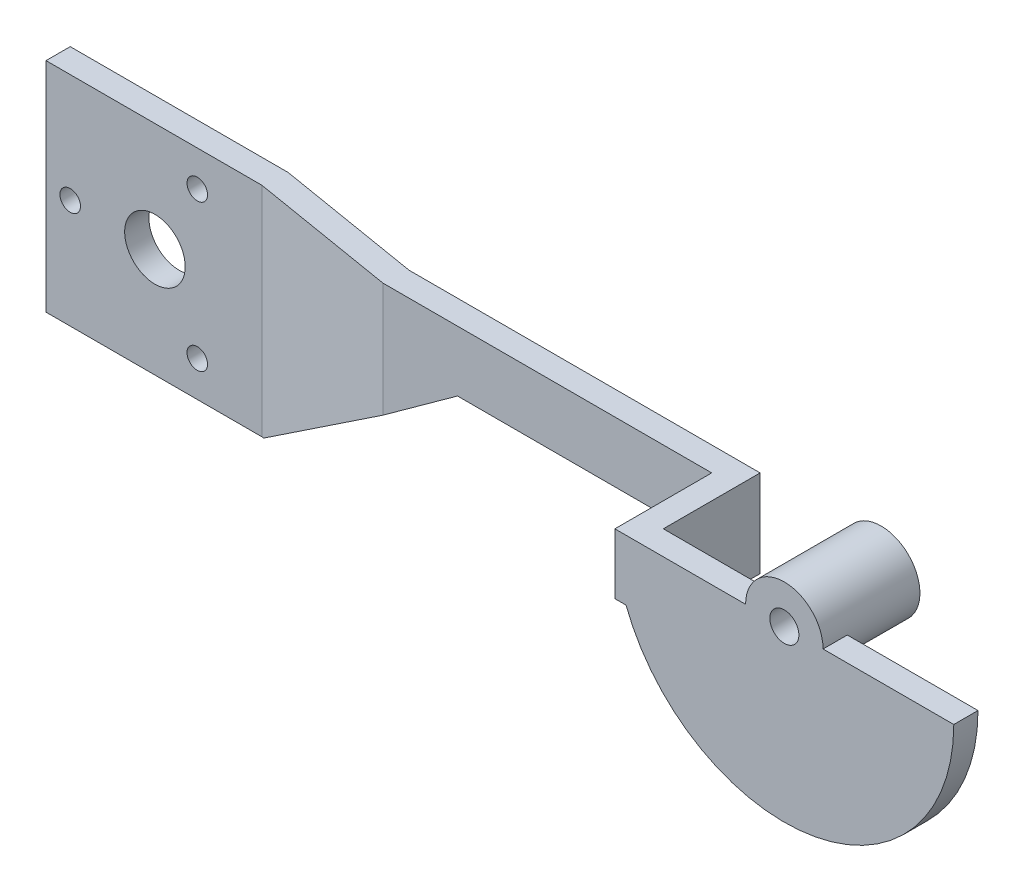
ISO-10303-21;
HEADER;
FILE_DESCRIPTION(('STEP AP214'),'2;1');
FILE_NAME('part.step','',(''),(''),'','','');
FILE_SCHEMA(('AUTOMOTIVE_DESIGN { 1 0 10303 214 1 1 1 1 }'));
ENDSEC;
DATA;
#1=APPLICATION_CONTEXT('core data for automotive mechanical design processes');
#2=APPLICATION_PROTOCOL_DEFINITION('international standard','automotive_design',2000,#1);
#3=PRODUCT_CONTEXT('',#1,'mechanical');
#4=PRODUCT('Part','Part','',(#3));
#5=PRODUCT_RELATED_PRODUCT_CATEGORY('part','',(#4));
#6=PRODUCT_DEFINITION_FORMATION('','',#4);
#7=PRODUCT_DEFINITION_CONTEXT('part definition',#1,'design');
#8=PRODUCT_DEFINITION('design','',#6,#7);
#9=PRODUCT_DEFINITION_SHAPE('','',#8);
#10=(LENGTH_UNIT() NAMED_UNIT(*) SI_UNIT(.MILLI.,.METRE.));
#11=(NAMED_UNIT(*) PLANE_ANGLE_UNIT() SI_UNIT($,.RADIAN.));
#12=(NAMED_UNIT(*) SI_UNIT($,.STERADIAN.) SOLID_ANGLE_UNIT());
#13=UNCERTAINTY_MEASURE_WITH_UNIT(LENGTH_MEASURE(1.E-05),#10,'distance_accuracy_value','');
#14=(GEOMETRIC_REPRESENTATION_CONTEXT(3) GLOBAL_UNCERTAINTY_ASSIGNED_CONTEXT((#13)) GLOBAL_UNIT_ASSIGNED_CONTEXT((#10,
#11,#12)) REPRESENTATION_CONTEXT('',''));
#15=CARTESIAN_POINT('',(0.,0.,0.));
#16=DIRECTION('',(0.,0.,1.));
#17=DIRECTION('',(1.,0.,0.));
#18=AXIS2_PLACEMENT_3D('',#15,#16,#17);
#19=CARTESIAN_POINT('',(310.,45.0000000000001,60.));
#20=DIRECTION('',(0.,0.,-1.));
#21=DIRECTION('',(-1.,0.,0.));
#22=AXIS2_PLACEMENT_3D('',#19,#20,#21);
#23=CYLINDRICAL_SURFACE('',#22,5.99999999999999);
#24=CARTESIAN_POINT('',(310.,45.0000000000001,60.));
#25=DIRECTION('',(0.,0.,1.));
#26=DIRECTION('',(1.,0.,0.));
#27=AXIS2_PLACEMENT_3D('',#24,#25,#26);
#28=CIRCLE('',#27,5.99999999999999);
#29=CARTESIAN_POINT('',(316.,45.0000000000001,60.));
#30=VERTEX_POINT('',#29);
#31=EDGE_CURVE('E297',#30,#30,#28,.T.);
#32=ORIENTED_EDGE('',*,*,#31,.T.);
#33=EDGE_LOOP('',(#32));
#34=FACE_BOUND('',#33,.T.);
#35=CARTESIAN_POINT('',(310.,45.0000000000001,20.));
#36=DIRECTION('',(0.,0.,-1.));
#37=DIRECTION('',(-1.,0.,0.));
#38=AXIS2_PLACEMENT_3D('',#35,#36,#37);
#39=CIRCLE('',#38,5.99999999999999);
#40=CARTESIAN_POINT('',(304.,45.0000000000001,20.));
#41=VERTEX_POINT('',#40);
#42=EDGE_CURVE('E574',#41,#41,#39,.T.);
#43=ORIENTED_EDGE('',*,*,#42,.T.);
#44=EDGE_LOOP('',(#43));
#45=FACE_BOUND('',#44,.T.);
#46=ADVANCED_FACE('F35',(#34,#45),#23,.F.);
#47=CARTESIAN_POINT('',(310.,45.0000000000001,60.));
#48=DIRECTION('',(0.,0.,-1.));
#49=DIRECTION('',(-1.,0.,0.));
#50=AXIS2_PLACEMENT_3D('',#47,#48,#49);
#51=CYLINDRICAL_SURFACE('',#50,16.);
#52=DIRECTION('',(0.,0.,-1.));
#53=VECTOR('',#52,1.);
#54=CARTESIAN_POINT('',(326.,45.,60.));
#55=LINE('',#54,#53);
#56=CARTESIAN_POINT('',(326.,45.,60.));
#57=VERTEX_POINT('',#56);
#58=CARTESIAN_POINT('',(326.,45.0000000000001,50.));
#59=VERTEX_POINT('',#58);
#60=EDGE_CURVE('E156',#57,#59,#55,.T.);
#61=ORIENTED_EDGE('',*,*,#60,.T.);
#62=CARTESIAN_POINT('',(310.,45.0000000000001,50.));
#63=DIRECTION('',(0.,0.,1.));
#64=DIRECTION('',(-1.,0.,0.));
#65=AXIS2_PLACEMENT_3D('',#62,#63,#64);
#66=CIRCLE('',#65,16.);
#67=CARTESIAN_POINT('',(294.,45.0000000000001,50.));
#68=VERTEX_POINT('',#67);
#69=EDGE_CURVE('E147',#68,#59,#66,.T.);
#70=ORIENTED_EDGE('',*,*,#69,.F.);
#71=DIRECTION('',(0.,0.,-1.));
#72=VECTOR('',#71,1.);
#73=CARTESIAN_POINT('',(294.,45.0000000000001,60.));
#74=LINE('',#73,#72);
#75=CARTESIAN_POINT('',(294.,45.0000000000001,60.));
#76=VERTEX_POINT('',#75);
#77=EDGE_CURVE('E153',#76,#68,#74,.T.);
#78=ORIENTED_EDGE('',*,*,#77,.F.);
#79=CARTESIAN_POINT('',(310.,45.0000000000001,60.));
#80=DIRECTION('',(0.,0.,1.));
#81=DIRECTION('',(1.,0.,0.));
#82=AXIS2_PLACEMENT_3D('',#79,#80,#81);
#83=CIRCLE('',#82,16.);
#84=EDGE_CURVE('E253',#57,#76,#83,.T.);
#85=ORIENTED_EDGE('',*,*,#84,.F.);
#86=EDGE_LOOP('',(#61,#70,#78,#85));
#87=FACE_BOUND('',#86,.T.);
#88=CARTESIAN_POINT('',(310.,45.0000000000001,20.));
#89=DIRECTION('',(0.,0.,-1.));
#90=DIRECTION('',(-1.,0.,0.));
#91=AXIS2_PLACEMENT_3D('',#88,#89,#90);
#92=CIRCLE('',#91,16.);
#93=CARTESIAN_POINT('',(294.,45.0000000000001,20.));
#94=VERTEX_POINT('',#93);
#95=EDGE_CURVE('E577',#94,#94,#92,.T.);
#96=ORIENTED_EDGE('',*,*,#95,.F.);
#97=EDGE_LOOP('',(#96));
#98=FACE_BOUND('',#97,.T.);
#99=ADVANCED_FACE('F149',(#87,#98),#51,.T.);
#100=CARTESIAN_POINT('',(310.,45.0000000000001,60.));
#101=DIRECTION('',(0.,0.,-1.));
#102=DIRECTION('',(-1.,0.,0.));
#103=AXIS2_PLACEMENT_3D('',#100,#101,#102);
#104=CYLINDRICAL_SURFACE('',#103,70.);
#105=DIRECTION('',(0.,0.,-1.));
#106=VECTOR('',#105,1.);
#107=CARTESIAN_POINT('',(250.,8.94448724536018,60.));
#108=LINE('',#107,#106);
#109=CARTESIAN_POINT('',(250.,8.94448724536017,9.99999999999997));
#110=VERTEX_POINT('',#109);
#111=CARTESIAN_POINT('',(250.,8.94448724536018,50.));
#112=VERTEX_POINT('',#111);
#113=EDGE_CURVE('E283',#110,#112,#108,.F.);
#114=ORIENTED_EDGE('',*,*,#113,.T.);
#115=CARTESIAN_POINT('',(310.,45.0000000000001,50.));
#116=DIRECTION('',(0.,0.,1.));
#117=DIRECTION('',(1.,0.,0.));
#118=AXIS2_PLACEMENT_3D('',#115,#116,#117);
#119=CIRCLE('',#118,70.);
#120=CARTESIAN_POINT('',(380.,45.0000000000001,50.));
#121=VERTEX_POINT('',#120);
#122=EDGE_CURVE('E286',#112,#121,#119,.T.);
#123=ORIENTED_EDGE('',*,*,#122,.T.);
#124=DIRECTION('',(0.,0.,-1.));
#125=VECTOR('',#124,1.);
#126=CARTESIAN_POINT('',(380.,45.0000000000001,60.));
#127=LINE('',#126,#125);
#128=CARTESIAN_POINT('',(380.,45.0000000000001,60.));
#129=VERTEX_POINT('',#128);
#130=EDGE_CURVE('E180',#129,#121,#127,.T.);
#131=ORIENTED_EDGE('',*,*,#130,.F.);
#132=CARTESIAN_POINT('',(310.,45.0000000000001,60.));
#133=DIRECTION('',(0.,0.,1.));
#134=DIRECTION('',(1.,0.,0.));
#135=AXIS2_PLACEMENT_3D('',#132,#133,#134);
#136=CIRCLE('',#135,70.);
#137=CARTESIAN_POINT('',(244.61651584689,20.0000000000001,60.));
#138=VERTEX_POINT('',#137);
#139=EDGE_CURVE('E246',#138,#129,#136,.T.);
#140=ORIENTED_EDGE('',*,*,#139,.F.);
#141=DIRECTION('',(0.,0.,-1.));
#142=VECTOR('',#141,1.);
#143=CARTESIAN_POINT('',(244.61651584689,20.0000000000001,60.));
#144=LINE('',#143,#142);
#145=CARTESIAN_POINT('',(244.61651584689,20.0000000000001,9.99999999999997));
#146=VERTEX_POINT('',#145);
#147=EDGE_CURVE('E214',#138,#146,#144,.T.);
#148=ORIENTED_EDGE('',*,*,#147,.T.);
#149=CARTESIAN_POINT('',(310.,45.0000000000001,9.99999999999997));
#150=DIRECTION('',(0.,0.,1.));
#151=DIRECTION('',(1.,0.,0.));
#152=AXIS2_PLACEMENT_3D('',#149,#150,#151);
#153=CIRCLE('',#152,70.);
#154=EDGE_CURVE('E280',#146,#110,#153,.T.);
#155=ORIENTED_EDGE('',*,*,#154,.T.);
#156=EDGE_LOOP('',(#114,#123,#131,#140,#148,#155));
#157=FACE_BOUND('',#156,.T.);
#158=ADVANCED_FACE('F37',(#157),#104,.T.);
#159=CARTESIAN_POINT('',(310.,45.0000000000001,60.));
#160=DIRECTION('',(0.,0.,1.));
#161=DIRECTION('',(1.,0.,0.));
#162=AXIS2_PLACEMENT_3D('',#159,#160,#161);
#163=PLANE('',#162);
#164=DIRECTION('',(0.,1.,0.));
#165=VECTOR('',#164,1.);
#166=CARTESIAN_POINT('',(240.,-45.,60.));
#167=LINE('',#166,#165);
#168=CARTESIAN_POINT('',(240.,20.0000000000001,60.));
#169=VERTEX_POINT('',#168);
#170=CARTESIAN_POINT('',(240.,45.,60.));
#171=VERTEX_POINT('',#170);
#172=EDGE_CURVE('E159',#169,#171,#167,.T.);
#173=ORIENTED_EDGE('',*,*,#172,.F.);
#174=DIRECTION('',(1.,0.,0.));
#175=VECTOR('',#174,1.);
#176=CARTESIAN_POINT('',(135.,20.,60.));
#177=LINE('',#176,#175);
#178=EDGE_CURVE('E58',#169,#138,#177,.T.);
#179=ORIENTED_EDGE('',*,*,#178,.T.);
#180=ORIENTED_EDGE('',*,*,#139,.T.);
#181=DIRECTION('',(-1.,0.,0.));
#182=VECTOR('',#181,1.);
#183=CARTESIAN_POINT('',(380.,45.0000000000001,60.));
#184=LINE('',#183,#182);
#185=EDGE_CURVE('E248',#129,#57,#184,.T.);
#186=ORIENTED_EDGE('',*,*,#185,.T.);
#187=ORIENTED_EDGE('',*,*,#84,.T.);
#188=DIRECTION('',(-1.,0.,0.));
#189=VECTOR('',#188,1.);
#190=CARTESIAN_POINT('',(294.,45.0000000000001,60.));
#191=LINE('',#190,#189);
#192=EDGE_CURVE('E177',#76,#171,#191,.T.);
#193=ORIENTED_EDGE('',*,*,#192,.T.);
#194=EDGE_LOOP('',(#173,#179,#180,#186,#187,#193));
#195=FACE_BOUND('',#194,.T.);
#196=ORIENTED_EDGE('',*,*,#31,.F.);
#197=EDGE_LOOP('',(#196));
#198=FACE_BOUND('',#197,.T.);
#199=ADVANCED_FACE('F255',(#195,#198),#163,.T.);
#200=CARTESIAN_POINT('',(310.,45.0000000000001,0.));
#201=DIRECTION('',(0.,0.,1.));
#202=DIRECTION('',(1.,0.,0.));
#203=AXIS2_PLACEMENT_3D('',#200,#201,#202);
#204=PLANE('',#203);
#205=CARTESIAN_POINT('',(0.,0.,0.));
#206=DIRECTION('',(0.,0.,1.));
#207=DIRECTION('',(1.,0.,0.));
#208=AXIS2_PLACEMENT_3D('',#205,#206,#207);
#209=CIRCLE('',#208,12.5);
#210=CARTESIAN_POINT('',(12.5,0.,0.));
#211=VERTEX_POINT('',#210);
#212=EDGE_CURVE('E160',#211,#211,#209,.T.);
#213=ORIENTED_EDGE('',*,*,#212,.T.);
#214=EDGE_LOOP('',(#213));
#215=FACE_BOUND('',#214,.T.);
#216=CARTESIAN_POINT('',(17.4999999999999,30.3108891324554,0.));
#217=DIRECTION('',(0.,0.,1.));
#218=DIRECTION('',(1.,0.,0.));
#219=AXIS2_PLACEMENT_3D('',#216,#217,#218);
#220=CIRCLE('',#219,4.25);
#221=CARTESIAN_POINT('',(21.7499999999999,30.3108891324554,0.));
#222=VERTEX_POINT('',#221);
#223=EDGE_CURVE('E291',#222,#222,#220,.T.);
#224=ORIENTED_EDGE('',*,*,#223,.T.);
#225=EDGE_LOOP('',(#224));
#226=FACE_BOUND('',#225,.T.);
#227=DIRECTION('',(-1.,0.,0.));
#228=VECTOR('',#227,1.);
#229=CARTESIAN_POINT('',(294.,45.0000000000001,0.));
#230=LINE('',#229,#228);
#231=CARTESIAN_POINT('',(45.,45.,0.));
#232=VERTEX_POINT('',#231);
#233=CARTESIAN_POINT('',(-45.,45.,0.));
#234=VERTEX_POINT('',#233);
#235=EDGE_CURVE('E240',#232,#234,#230,.T.);
#236=ORIENTED_EDGE('',*,*,#235,.F.);
#237=DIRECTION('',(0.,1.,0.));
#238=VECTOR('',#237,1.);
#239=CARTESIAN_POINT('',(45.0000000000001,-45.0000000000001,0.));
#240=LINE('',#239,#238);
#241=CARTESIAN_POINT('',(45.0000000000001,-45.0000000000001,0.));
#242=VERTEX_POINT('',#241);
#243=EDGE_CURVE('E245',#242,#232,#240,.T.);
#244=ORIENTED_EDGE('',*,*,#243,.F.);
#245=DIRECTION('',(1.,0.,0.));
#246=VECTOR('',#245,1.);
#247=CARTESIAN_POINT('',(-45.,-45.,0.));
#248=LINE('',#247,#246);
#249=CARTESIAN_POINT('',(-45.,-45.,0.));
#250=VERTEX_POINT('',#249);
#251=EDGE_CURVE('E229',#250,#242,#248,.T.);
#252=ORIENTED_EDGE('',*,*,#251,.F.);
#253=DIRECTION('',(0.,-1.,0.));
#254=VECTOR('',#253,1.);
#255=CARTESIAN_POINT('',(-45.,45.,0.));
#256=LINE('',#255,#254);
#257=EDGE_CURVE('E235',#234,#250,#256,.T.);
#258=ORIENTED_EDGE('',*,*,#257,.F.);
#259=EDGE_LOOP('',(#236,#244,#252,#258));
#260=FACE_BOUND('',#259,.T.);
#261=CARTESIAN_POINT('',(-35.,0.,0.));
#262=DIRECTION('',(0.,0.,1.));
#263=DIRECTION('',(1.,0.,0.));
#264=AXIS2_PLACEMENT_3D('',#261,#262,#263);
#265=CIRCLE('',#264,4.25);
#266=CARTESIAN_POINT('',(-30.75,0.,0.));
#267=VERTEX_POINT('',#266);
#268=EDGE_CURVE('E294',#267,#267,#265,.T.);
#269=ORIENTED_EDGE('',*,*,#268,.T.);
#270=EDGE_LOOP('',(#269));
#271=FACE_BOUND('',#270,.T.);
#272=CARTESIAN_POINT('',(17.4999999999999,-30.3108891324554,0.));
#273=DIRECTION('',(0.,0.,1.));
#274=DIRECTION('',(1.,0.,0.));
#275=AXIS2_PLACEMENT_3D('',#272,#273,#274);
#276=CIRCLE('',#275,4.25);
#277=CARTESIAN_POINT('',(21.7499999999999,-30.3108891324554,0.));
#278=VERTEX_POINT('',#277);
#279=EDGE_CURVE('E288',#278,#278,#276,.T.);
#280=ORIENTED_EDGE('',*,*,#279,.T.);
#281=EDGE_LOOP('',(#280));
#282=FACE_BOUND('',#281,.T.);
#283=ADVANCED_FACE('F243',(#215,#226,#260,#271,#282),#204,.F.);
#284=CARTESIAN_POINT('',(380.,45.0000000000001,60.));
#285=DIRECTION('',(0.,-1.,0.));
#286=DIRECTION('',(1.,0.,0.));
#287=AXIS2_PLACEMENT_3D('',#284,#285,#286);
#288=PLANE('',#287);
#289=ORIENTED_EDGE('',*,*,#130,.T.);
#290=DIRECTION('',(1.,0.,0.));
#291=VECTOR('',#290,1.);
#292=CARTESIAN_POINT('',(380.,45.0000000000001,50.));
#293=LINE('',#292,#291);
#294=EDGE_CURVE('E170',#59,#121,#293,.T.);
#295=ORIENTED_EDGE('',*,*,#294,.F.);
#296=ORIENTED_EDGE('',*,*,#60,.F.);
#297=ORIENTED_EDGE('',*,*,#185,.F.);
#298=EDGE_LOOP('',(#289,#295,#296,#297));
#299=FACE_BOUND('',#298,.T.);
#300=ADVANCED_FACE('F260',(#299),#288,.F.);
#301=CARTESIAN_POINT('',(294.,45.0000000000001,60.));
#302=DIRECTION('',(0.,-1.,0.));
#303=DIRECTION('',(1.,0.,0.));
#304=AXIS2_PLACEMENT_3D('',#301,#302,#303);
#305=PLANE('',#304);
#306=DIRECTION('',(0.,0.,-1.));
#307=VECTOR('',#306,1.);
#308=CARTESIAN_POINT('',(-45.,45.,60.));
#309=LINE('',#308,#307);
#310=CARTESIAN_POINT('',(-45.,45.,10.));
#311=VERTEX_POINT('',#310);
#312=EDGE_CURVE('E178',#311,#234,#309,.T.);
#313=ORIENTED_EDGE('',*,*,#312,.F.);
#314=DIRECTION('',(-1.,0.,0.));
#315=VECTOR('',#314,1.);
#316=CARTESIAN_POINT('',(44.1723746970178,45.,10.));
#317=LINE('',#316,#315);
#318=CARTESIAN_POINT('',(44.1723746970178,45.,10.));
#319=VERTEX_POINT('',#318);
#320=EDGE_CURVE('E199',#319,#311,#317,.T.);
#321=ORIENTED_EDGE('',*,*,#320,.F.);
#322=DIRECTION('',(-0.986393923832144,0.,-0.164398987305357));
#323=VECTOR('',#322,1.);
#324=CARTESIAN_POINT('',(104.172374697018,45.,20.));
#325=LINE('',#324,#323);
#326=CARTESIAN_POINT('',(104.172374697018,45.,20.));
#327=VERTEX_POINT('',#326);
#328=EDGE_CURVE('E317',#327,#319,#325,.T.);
#329=ORIENTED_EDGE('',*,*,#328,.F.);
#330=DIRECTION('',(-1.,0.,0.));
#331=VECTOR('',#330,1.);
#332=CARTESIAN_POINT('',(240.,45.,20.));
#333=LINE('',#332,#331);
#334=CARTESIAN_POINT('',(240.,45.,20.));
#335=VERTEX_POINT('',#334);
#336=EDGE_CURVE('E320',#335,#327,#333,.T.);
#337=ORIENTED_EDGE('',*,*,#336,.F.);
#338=DIRECTION('',(0.,0.,-1.));
#339=VECTOR('',#338,1.);
#340=CARTESIAN_POINT('',(240.,45.,60.));
#341=LINE('',#340,#339);
#342=EDGE_CURVE('E323',#171,#335,#341,.T.);
#343=ORIENTED_EDGE('',*,*,#342,.F.);
#344=ORIENTED_EDGE('',*,*,#192,.F.);
#345=ORIENTED_EDGE('',*,*,#77,.T.);
#346=DIRECTION('',(1.,0.,0.));
#347=VECTOR('',#346,1.);
#348=CARTESIAN_POINT('',(294.,45.0000000000001,50.));
#349=LINE('',#348,#347);
#350=CARTESIAN_POINT('',(250.,45.,50.));
#351=VERTEX_POINT('',#350);
#352=EDGE_CURVE('E163',#351,#68,#349,.T.);
#353=ORIENTED_EDGE('',*,*,#352,.F.);
#354=DIRECTION('',(0.,0.,1.));
#355=VECTOR('',#354,1.);
#356=CARTESIAN_POINT('',(250.,45.,50.));
#357=LINE('',#356,#355);
#358=CARTESIAN_POINT('',(250.,45.,9.99999999999997));
#359=VERTEX_POINT('',#358);
#360=EDGE_CURVE('E271',#359,#351,#357,.T.);
#361=ORIENTED_EDGE('',*,*,#360,.F.);
#362=DIRECTION('',(1.,0.,0.));
#363=VECTOR('',#362,1.);
#364=CARTESIAN_POINT('',(250.,45.,9.99999999999997));
#365=LINE('',#364,#363);
#366=CARTESIAN_POINT('',(105.,45.,9.99999999999997));
#367=VERTEX_POINT('',#366);
#368=EDGE_CURVE('E265',#367,#359,#365,.T.);
#369=ORIENTED_EDGE('',*,*,#368,.F.);
#370=DIRECTION('',(0.986393923832144,0.,0.164398987305357));
#371=VECTOR('',#370,1.);
#372=CARTESIAN_POINT('',(105.,45.,9.99999999999997));
#373=LINE('',#372,#371);
#374=EDGE_CURVE('E262',#232,#367,#373,.T.);
#375=ORIENTED_EDGE('',*,*,#374,.F.);
#376=ORIENTED_EDGE('',*,*,#235,.T.);
#377=EDGE_LOOP('',(#313,#321,#329,#337,#343,#344,#345,#353,#361,#369,#375,#376));
#378=FACE_BOUND('',#377,.T.);
#379=ADVANCED_FACE('F174',(#378),#305,.F.);
#380=CARTESIAN_POINT('',(-45.,45.,60.));
#381=DIRECTION('',(1.,0.,0.));
#382=DIRECTION('',(0.,1.,0.));
#383=AXIS2_PLACEMENT_3D('',#380,#381,#382);
#384=PLANE('',#383);
#385=DIRECTION('',(0.,0.,-1.));
#386=VECTOR('',#385,1.);
#387=CARTESIAN_POINT('',(-45.,-45.,60.));
#388=LINE('',#387,#386);
#389=CARTESIAN_POINT('',(-45.,-45.0000000000001,10.));
#390=VERTEX_POINT('',#389);
#391=EDGE_CURVE('E182',#390,#250,#388,.T.);
#392=ORIENTED_EDGE('',*,*,#391,.F.);
#393=DIRECTION('',(0.,1.,0.));
#394=VECTOR('',#393,1.);
#395=CARTESIAN_POINT('',(-45.,-45.0000000000001,10.));
#396=LINE('',#395,#394);
#397=EDGE_CURVE('E309',#390,#311,#396,.T.);
#398=ORIENTED_EDGE('',*,*,#397,.T.);
#399=ORIENTED_EDGE('',*,*,#312,.T.);
#400=ORIENTED_EDGE('',*,*,#257,.T.);
#401=EDGE_LOOP('',(#392,#398,#399,#400));
#402=FACE_BOUND('',#401,.T.);
#403=ADVANCED_FACE('F236',(#402),#384,.F.);
#404=CARTESIAN_POINT('',(-45.,-45.,60.));
#405=DIRECTION('',(0.,1.,0.));
#406=DIRECTION('',(-1.,0.,0.));
#407=AXIS2_PLACEMENT_3D('',#404,#405,#406);
#408=PLANE('',#407);
#409=DIRECTION('',(-0.986393923832144,0.,-0.164398987305357));
#410=VECTOR('',#409,1.);
#411=CARTESIAN_POINT('',(104.172374697018,-45.0000000000001,20.));
#412=LINE('',#411,#410);
#413=CARTESIAN_POINT('',(44.9999999999998,-45.0000000000001,10.137937550497));
#414=VERTEX_POINT('',#413);
#415=CARTESIAN_POINT('',(44.1723746970179,-45.0000000000001,10.));
#416=VERTEX_POINT('',#415);
#417=EDGE_CURVE('E306',#414,#416,#412,.T.);
#418=ORIENTED_EDGE('',*,*,#417,.T.);
#419=DIRECTION('',(-1.,0.,0.));
#420=VECTOR('',#419,1.);
#421=CARTESIAN_POINT('',(44.1723746970179,-45.0000000000001,10.));
#422=LINE('',#421,#420);
#423=EDGE_CURVE('E231',#416,#390,#422,.T.);
#424=ORIENTED_EDGE('',*,*,#423,.T.);
#425=ORIENTED_EDGE('',*,*,#391,.T.);
#426=ORIENTED_EDGE('',*,*,#251,.T.);
#427=DIRECTION('',(0.,0.,-1.));
#428=VECTOR('',#427,1.);
#429=CARTESIAN_POINT('',(45.,-45.,60.));
#430=LINE('',#429,#428);
#431=EDGE_CURVE('E213',#414,#242,#430,.T.);
#432=ORIENTED_EDGE('',*,*,#431,.F.);
#433=EDGE_LOOP('',(#418,#424,#425,#426,#432));
#434=FACE_BOUND('',#433,.T.);
#435=ADVANCED_FACE('F226',(#434),#408,.F.);
#436=CARTESIAN_POINT('',(45.,-45.,60.));
#437=DIRECTION('',(-0.585490553844358,0.810679228399881,0.));
#438=DIRECTION('',(-0.810679228399881,-0.585490553844358,0.));
#439=AXIS2_PLACEMENT_3D('',#436,#437,#438);
#440=PLANE('',#439);
#441=DIRECTION('',(-0.810679228399881,-0.585490553844358,0.));
#442=VECTOR('',#441,1.);
#443=CARTESIAN_POINT('',(45.,-45.,20.));
#444=LINE('',#443,#442);
#445=CARTESIAN_POINT('',(135.,20.,20.));
#446=VERTEX_POINT('',#445);
#447=CARTESIAN_POINT('',(104.172374697018,-2.26439605215381,20.));
#448=VERTEX_POINT('',#447);
#449=EDGE_CURVE('E171',#446,#448,#444,.T.);
#450=ORIENTED_EDGE('',*,*,#449,.T.);
#451=DIRECTION('',(-0.803379316819413,-0.580218395480687,-0.133896552803235));
#452=VECTOR('',#451,1.);
#453=CARTESIAN_POINT('',(50.3636481519386,-41.1262541124888,11.0318789091534));
#454=LINE('',#453,#452);
#455=EDGE_CURVE('E11',#448,#414,#454,.T.);
#456=ORIENTED_EDGE('',*,*,#455,.T.);
#457=ORIENTED_EDGE('',*,*,#431,.T.);
#458=DIRECTION('',(0.803379316819413,0.580218395480687,0.133896552803235));
#459=VECTOR('',#458,1.);
#460=CARTESIAN_POINT('',(51.4541832669323,-40.3386454183267,1.07569721115536));
#461=LINE('',#460,#459);
#462=CARTESIAN_POINT('',(105.,-1.66666666666666,9.99999999999997));
#463=VERTEX_POINT('',#462);
#464=EDGE_CURVE('E191',#242,#463,#461,.T.);
#465=ORIENTED_EDGE('',*,*,#464,.T.);
#466=DIRECTION('',(0.810679228399881,0.585490553844358,0.));
#467=VECTOR('',#466,1.);
#468=CARTESIAN_POINT('',(45.,-45.,9.99999999999997));
#469=LINE('',#468,#467);
#470=CARTESIAN_POINT('',(135.,20.,9.99999999999997));
#471=VERTEX_POINT('',#470);
#472=EDGE_CURVE('E212',#463,#471,#469,.T.);
#473=ORIENTED_EDGE('',*,*,#472,.T.);
#474=DIRECTION('',(0.,0.,-1.));
#475=VECTOR('',#474,1.);
#476=CARTESIAN_POINT('',(135.,20.,60.));
#477=LINE('',#476,#475);
#478=EDGE_CURVE('E205',#446,#471,#477,.T.);
#479=ORIENTED_EDGE('',*,*,#478,.F.);
#480=EDGE_LOOP('',(#450,#456,#457,#465,#473,#479));
#481=FACE_BOUND('',#480,.T.);
#482=ADVANCED_FACE('F211',(#481),#440,.F.);
#483=CARTESIAN_POINT('',(135.,20.,60.));
#484=DIRECTION('',(0.,1.,0.));
#485=DIRECTION('',(-1.,0.,0.));
#486=AXIS2_PLACEMENT_3D('',#483,#484,#485);
#487=PLANE('',#486);
#488=DIRECTION('',(0.,0.,-1.));
#489=VECTOR('',#488,1.);
#490=CARTESIAN_POINT('',(240.,20.0000000000001,60.));
#491=LINE('',#490,#489);
#492=CARTESIAN_POINT('',(240.,20.0000000000001,20.));
#493=VERTEX_POINT('',#492);
#494=EDGE_CURVE('E194',#169,#493,#491,.T.);
#495=ORIENTED_EDGE('',*,*,#494,.T.);
#496=DIRECTION('',(-1.,0.,0.));
#497=VECTOR('',#496,1.);
#498=CARTESIAN_POINT('',(135.,20.,20.));
#499=LINE('',#498,#497);
#500=EDGE_CURVE('E43',#493,#446,#499,.T.);
#501=ORIENTED_EDGE('',*,*,#500,.T.);
#502=ORIENTED_EDGE('',*,*,#478,.T.);
#503=DIRECTION('',(1.,0.,0.));
#504=VECTOR('',#503,1.);
#505=CARTESIAN_POINT('',(135.,20.,9.99999999999997));
#506=LINE('',#505,#504);
#507=EDGE_CURVE('E188',#471,#146,#506,.T.);
#508=ORIENTED_EDGE('',*,*,#507,.T.);
#509=ORIENTED_EDGE('',*,*,#147,.F.);
#510=ORIENTED_EDGE('',*,*,#178,.F.);
#511=EDGE_LOOP('',(#495,#501,#502,#508,#509,#510));
#512=FACE_BOUND('',#511,.T.);
#513=ADVANCED_FACE('F204',(#512),#487,.F.);
#514=CARTESIAN_POINT('',(-35.,0.,60.));
#515=DIRECTION('',(0.,0.,-1.));
#516=DIRECTION('',(-1.,0.,0.));
#517=AXIS2_PLACEMENT_3D('',#514,#515,#516);
#518=CYLINDRICAL_SURFACE('',#517,4.25);
#519=CARTESIAN_POINT('',(-35.,0.,10.));
#520=DIRECTION('',(0.,0.,-1.));
#521=DIRECTION('',(-1.,0.,0.));
#522=AXIS2_PLACEMENT_3D('',#519,#520,#521);
#523=CIRCLE('',#522,4.25);
#524=CARTESIAN_POINT('',(-39.25,0.,10.));
#525=VERTEX_POINT('',#524);
#526=EDGE_CURVE('E327',#525,#525,#523,.T.);
#527=ORIENTED_EDGE('',*,*,#526,.F.);
#528=EDGE_LOOP('',(#527));
#529=FACE_BOUND('',#528,.T.);
#530=ORIENTED_EDGE('',*,*,#268,.F.);
#531=EDGE_LOOP('',(#530));
#532=FACE_BOUND('',#531,.T.);
#533=ADVANCED_FACE('F334',(#529,#532),#518,.F.);
#534=CARTESIAN_POINT('',(17.4999999999999,30.3108891324554,60.));
#535=DIRECTION('',(0.,0.,-1.));
#536=DIRECTION('',(-1.,0.,0.));
#537=AXIS2_PLACEMENT_3D('',#534,#535,#536);
#538=CYLINDRICAL_SURFACE('',#537,4.25);
#539=CARTESIAN_POINT('',(17.4999999999999,30.3108891324554,10.));
#540=DIRECTION('',(0.,0.,-1.));
#541=DIRECTION('',(-1.,0.,0.));
#542=AXIS2_PLACEMENT_3D('',#539,#540,#541);
#543=CIRCLE('',#542,4.25);
#544=CARTESIAN_POINT('',(13.2499999999999,30.3108891324554,10.));
#545=VERTEX_POINT('',#544);
#546=EDGE_CURVE('E198',#545,#545,#543,.T.);
#547=ORIENTED_EDGE('',*,*,#546,.F.);
#548=EDGE_LOOP('',(#547));
#549=FACE_BOUND('',#548,.T.);
#550=ORIENTED_EDGE('',*,*,#223,.F.);
#551=EDGE_LOOP('',(#550));
#552=FACE_BOUND('',#551,.T.);
#553=ADVANCED_FACE('F337',(#549,#552),#538,.F.);
#554=CARTESIAN_POINT('',(17.4999999999999,-30.3108891324554,60.));
#555=DIRECTION('',(0.,0.,-1.));
#556=DIRECTION('',(-1.,0.,0.));
#557=AXIS2_PLACEMENT_3D('',#554,#555,#556);
#558=CYLINDRICAL_SURFACE('',#557,4.25);
#559=CARTESIAN_POINT('',(17.4999999999999,-30.3108891324554,10.));
#560=DIRECTION('',(0.,0.,-1.));
#561=DIRECTION('',(-1.,0.,0.));
#562=AXIS2_PLACEMENT_3D('',#559,#560,#561);
#563=CIRCLE('',#562,4.25);
#564=CARTESIAN_POINT('',(13.2499999999999,-30.3108891324554,10.));
#565=VERTEX_POINT('',#564);
#566=EDGE_CURVE('E195',#565,#565,#563,.T.);
#567=ORIENTED_EDGE('',*,*,#566,.F.);
#568=EDGE_LOOP('',(#567));
#569=FACE_BOUND('',#568,.T.);
#570=ORIENTED_EDGE('',*,*,#279,.F.);
#571=EDGE_LOOP('',(#570));
#572=FACE_BOUND('',#571,.T.);
#573=ADVANCED_FACE('F346',(#569,#572),#558,.F.);
#574=CARTESIAN_POINT('',(380.,-45.,50.));
#575=DIRECTION('',(0.,0.,1.));
#576=DIRECTION('',(1.,0.,0.));
#577=AXIS2_PLACEMENT_3D('',#574,#575,#576);
#578=PLANE('',#577);
#579=ORIENTED_EDGE('',*,*,#122,.F.);
#580=DIRECTION('',(0.,1.,0.));
#581=VECTOR('',#580,1.);
#582=CARTESIAN_POINT('',(250.,-45.,50.));
#583=LINE('',#582,#581);
#584=EDGE_CURVE('E166',#112,#351,#583,.T.);
#585=ORIENTED_EDGE('',*,*,#584,.T.);
#586=ORIENTED_EDGE('',*,*,#352,.T.);
#587=ORIENTED_EDGE('',*,*,#69,.T.);
#588=ORIENTED_EDGE('',*,*,#294,.T.);
#589=EDGE_LOOP('',(#579,#585,#586,#587,#588));
#590=FACE_BOUND('',#589,.T.);
#591=ADVANCED_FACE('F164',(#590),#578,.F.);
#592=CARTESIAN_POINT('',(250.,-45.,50.));
#593=DIRECTION('',(-1.,0.,0.));
#594=DIRECTION('',(0.,-1.,0.));
#595=AXIS2_PLACEMENT_3D('',#592,#593,#594);
#596=PLANE('',#595);
#597=DIRECTION('',(0.,1.,0.));
#598=VECTOR('',#597,1.);
#599=CARTESIAN_POINT('',(250.,-45.,9.99999999999997));
#600=LINE('',#599,#598);
#601=EDGE_CURVE('E274',#110,#359,#600,.T.);
#602=ORIENTED_EDGE('',*,*,#601,.T.);
#603=ORIENTED_EDGE('',*,*,#360,.T.);
#604=ORIENTED_EDGE('',*,*,#584,.F.);
#605=ORIENTED_EDGE('',*,*,#113,.F.);
#606=EDGE_LOOP('',(#602,#603,#604,#605));
#607=FACE_BOUND('',#606,.T.);
#608=ADVANCED_FACE('F354',(#607),#596,.F.);
#609=CARTESIAN_POINT('',(105.,-45.0000000000001,9.99999999999997));
#610=DIRECTION('',(-0.164398987305357,0.,0.986393923832144));
#611=DIRECTION('',(0.986393923832144,0.,0.164398987305357));
#612=AXIS2_PLACEMENT_3D('',#609,#610,#611);
#613=PLANE('',#612);
#614=ORIENTED_EDGE('',*,*,#243,.T.);
#615=ORIENTED_EDGE('',*,*,#374,.T.);
#616=DIRECTION('',(0.,1.,0.));
#617=VECTOR('',#616,1.);
#618=CARTESIAN_POINT('',(105.,-45.0000000000001,9.99999999999997));
#619=LINE('',#618,#617);
#620=EDGE_CURVE('E276',#463,#367,#619,.T.);
#621=ORIENTED_EDGE('',*,*,#620,.F.);
#622=ORIENTED_EDGE('',*,*,#464,.F.);
#623=EDGE_LOOP('',(#614,#615,#621,#622));
#624=FACE_BOUND('',#623,.T.);
#625=ADVANCED_FACE('F304',(#624),#613,.F.);
#626=CARTESIAN_POINT('',(250.,-45.,9.99999999999997));
#627=DIRECTION('',(0.,0.,1.));
#628=DIRECTION('',(1.,0.,0.));
#629=AXIS2_PLACEMENT_3D('',#626,#627,#628);
#630=PLANE('',#629);
#631=ORIENTED_EDGE('',*,*,#507,.F.);
#632=ORIENTED_EDGE('',*,*,#472,.F.);
#633=ORIENTED_EDGE('',*,*,#620,.T.);
#634=ORIENTED_EDGE('',*,*,#368,.T.);
#635=ORIENTED_EDGE('',*,*,#601,.F.);
#636=ORIENTED_EDGE('',*,*,#154,.F.);
#637=EDGE_LOOP('',(#631,#632,#633,#634,#635,#636));
#638=FACE_BOUND('',#637,.T.);
#639=ADVANCED_FACE('F443',(#638),#630,.F.);
#640=CARTESIAN_POINT('',(104.172374697018,-45.0000000000001,20.));
#641=DIRECTION('',(0.164398987305357,0.,-0.986393923832144));
#642=DIRECTION('',(-0.986393923832144,0.,-0.164398987305357));
#643=AXIS2_PLACEMENT_3D('',#640,#641,#642);
#644=PLANE('',#643);
#645=DIRECTION('',(0.,1.,0.));
#646=VECTOR('',#645,1.);
#647=CARTESIAN_POINT('',(104.172374697018,-45.0000000000001,20.));
#648=LINE('',#647,#646);
#649=EDGE_CURVE('E311',#448,#327,#648,.T.);
#650=ORIENTED_EDGE('',*,*,#649,.T.);
#651=ORIENTED_EDGE('',*,*,#328,.T.);
#652=DIRECTION('',(0.,1.,0.));
#653=VECTOR('',#652,1.);
#654=CARTESIAN_POINT('',(44.1723746970179,-45.0000000000001,10.));
#655=LINE('',#654,#653);
#656=EDGE_CURVE('E308',#416,#319,#655,.T.);
#657=ORIENTED_EDGE('',*,*,#656,.F.);
#658=ORIENTED_EDGE('',*,*,#417,.F.);
#659=ORIENTED_EDGE('',*,*,#455,.F.);
#660=EDGE_LOOP('',(#650,#651,#657,#658,#659));
#661=FACE_BOUND('',#660,.T.);
#662=ADVANCED_FACE('F452',(#661),#644,.F.);
#663=CARTESIAN_POINT('',(240.,-45.,20.));
#664=DIRECTION('',(0.,0.,-1.));
#665=DIRECTION('',(-1.,0.,0.));
#666=AXIS2_PLACEMENT_3D('',#663,#664,#665);
#667=PLANE('',#666);
#668=ORIENTED_EDGE('',*,*,#500,.F.);
#669=DIRECTION('',(0.,1.,0.));
#670=VECTOR('',#669,1.);
#671=CARTESIAN_POINT('',(240.,-45.,20.));
#672=LINE('',#671,#670);
#673=EDGE_CURVE('E50',#493,#335,#672,.T.);
#674=ORIENTED_EDGE('',*,*,#673,.T.);
#675=ORIENTED_EDGE('',*,*,#336,.T.);
#676=ORIENTED_EDGE('',*,*,#649,.F.);
#677=ORIENTED_EDGE('',*,*,#449,.F.);
#678=EDGE_LOOP('',(#668,#674,#675,#676,#677));
#679=FACE_BOUND('',#678,.T.);
#680=ADVANCED_FACE('F462',(#679),#667,.F.);
#681=CARTESIAN_POINT('',(240.,-45.,60.));
#682=DIRECTION('',(1.,0.,0.));
#683=DIRECTION('',(0.,1.,0.));
#684=AXIS2_PLACEMENT_3D('',#681,#682,#683);
#685=PLANE('',#684);
#686=ORIENTED_EDGE('',*,*,#172,.T.);
#687=ORIENTED_EDGE('',*,*,#342,.T.);
#688=ORIENTED_EDGE('',*,*,#673,.F.);
#689=ORIENTED_EDGE('',*,*,#494,.F.);
#690=EDGE_LOOP('',(#686,#687,#688,#689));
#691=FACE_BOUND('',#690,.T.);
#692=ADVANCED_FACE('F471',(#691),#685,.F.);
#693=CARTESIAN_POINT('',(44.1723746970179,-45.0000000000001,10.));
#694=DIRECTION('',(0.,0.,-1.));
#695=DIRECTION('',(-1.,0.,0.));
#696=AXIS2_PLACEMENT_3D('',#693,#694,#695);
#697=PLANE('',#696);
#698=CARTESIAN_POINT('',(0.,0.,10.));
#699=DIRECTION('',(0.,0.,1.));
#700=DIRECTION('',(1.,0.,0.));
#701=AXIS2_PLACEMENT_3D('',#698,#699,#700);
#702=CIRCLE('',#701,12.5);
#703=CARTESIAN_POINT('',(12.5,0.,10.));
#704=VERTEX_POINT('',#703);
#705=EDGE_CURVE('E578',#704,#704,#702,.T.);
#706=ORIENTED_EDGE('',*,*,#705,.F.);
#707=EDGE_LOOP('',(#706));
#708=FACE_BOUND('',#707,.T.);
#709=ORIENTED_EDGE('',*,*,#526,.T.);
#710=EDGE_LOOP('',(#709));
#711=FACE_BOUND('',#710,.T.);
#712=ORIENTED_EDGE('',*,*,#546,.T.);
#713=EDGE_LOOP('',(#712));
#714=FACE_BOUND('',#713,.T.);
#715=ORIENTED_EDGE('',*,*,#566,.T.);
#716=EDGE_LOOP('',(#715));
#717=FACE_BOUND('',#716,.T.);
#718=ORIENTED_EDGE('',*,*,#320,.T.);
#719=ORIENTED_EDGE('',*,*,#397,.F.);
#720=ORIENTED_EDGE('',*,*,#423,.F.);
#721=ORIENTED_EDGE('',*,*,#656,.T.);
#722=EDGE_LOOP('',(#718,#719,#720,#721));
#723=FACE_BOUND('',#722,.T.);
#724=ADVANCED_FACE('F331',(#708,#711,#714,#717,#723),#697,.F.);
#725=CARTESIAN_POINT('',(0.,0.,0.));
#726=DIRECTION('',(0.,0.,1.));
#727=DIRECTION('',(1.,0.,0.));
#728=AXIS2_PLACEMENT_3D('',#725,#726,#727);
#729=CYLINDRICAL_SURFACE('',#728,12.5);
#730=ORIENTED_EDGE('',*,*,#212,.F.);
#731=EDGE_LOOP('',(#730));
#732=FACE_BOUND('',#731,.T.);
#733=ORIENTED_EDGE('',*,*,#705,.T.);
#734=EDGE_LOOP('',(#733));
#735=FACE_BOUND('',#734,.T.);
#736=ADVANCED_FACE('F488',(#732,#735),#729,.F.);
#737=CARTESIAN_POINT('',(310.,45.0000000000001,20.));
#738=DIRECTION('',(0.,0.,-1.));
#739=DIRECTION('',(-1.,0.,0.));
#740=AXIS2_PLACEMENT_3D('',#737,#738,#739);
#741=PLANE('',#740);
#742=ORIENTED_EDGE('',*,*,#42,.F.);
#743=EDGE_LOOP('',(#742));
#744=FACE_BOUND('',#743,.T.);
#745=ORIENTED_EDGE('',*,*,#95,.T.);
#746=EDGE_LOOP('',(#745));
#747=FACE_BOUND('',#746,.T.);
#748=ADVANCED_FACE('F498',(#744,#747),#741,.T.);
#749=CLOSED_SHELL('',(#46,#99,#158,#199,#283,#300,#379,#403,#435,#482,#513,#533,#553,#573,#591,
#608,#625,#639,#662,#680,#692,#724,#736,#748));
#750=MANIFOLD_SOLID_BREP('B2',#749);
#751=ADVANCED_BREP_SHAPE_REPRESENTATION('',(#18,#750),#14);
#752=SHAPE_DEFINITION_REPRESENTATION(#9,#751);
ENDSEC;
END-ISO-10303-21;
